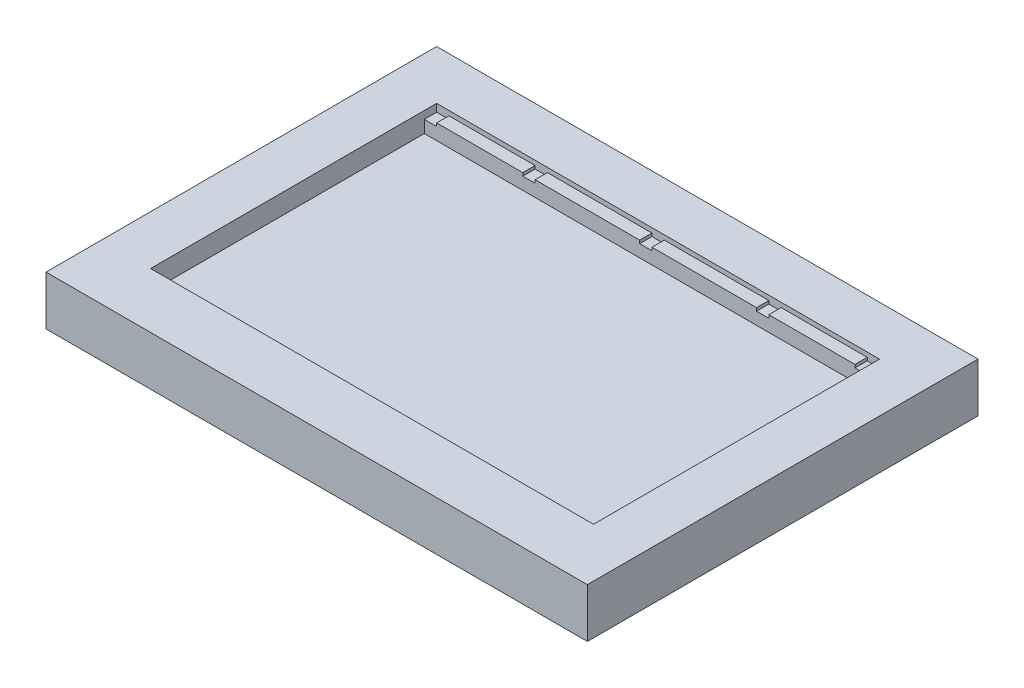
ISO-10303-21;
HEADER;
FILE_DESCRIPTION(('STEP AP214'),'2;1');
FILE_NAME('part.step','',(''),(''),'','','');
FILE_SCHEMA(('AUTOMOTIVE_DESIGN { 1 0 10303 214 1 1 1 1 }'));
ENDSEC;
DATA;
#1=APPLICATION_CONTEXT('core data for automotive mechanical design processes');
#2=APPLICATION_PROTOCOL_DEFINITION('international standard','automotive_design',2000,#1);
#3=PRODUCT_CONTEXT('',#1,'mechanical');
#4=PRODUCT('Part','Part','',(#3));
#5=PRODUCT_RELATED_PRODUCT_CATEGORY('part','',(#4));
#6=PRODUCT_DEFINITION_FORMATION('','',#4);
#7=PRODUCT_DEFINITION_CONTEXT('part definition',#1,'design');
#8=PRODUCT_DEFINITION('design','',#6,#7);
#9=PRODUCT_DEFINITION_SHAPE('','',#8);
#10=(LENGTH_UNIT() NAMED_UNIT(*) SI_UNIT(.MILLI.,.METRE.));
#11=(NAMED_UNIT(*) PLANE_ANGLE_UNIT() SI_UNIT($,.RADIAN.));
#12=(NAMED_UNIT(*) SI_UNIT($,.STERADIAN.) SOLID_ANGLE_UNIT());
#13=UNCERTAINTY_MEASURE_WITH_UNIT(LENGTH_MEASURE(1.E-05),#10,'distance_accuracy_value','');
#14=(GEOMETRIC_REPRESENTATION_CONTEXT(3) GLOBAL_UNCERTAINTY_ASSIGNED_CONTEXT((#13)) GLOBAL_UNIT_ASSIGNED_CONTEXT((#10,
#11,#12)) REPRESENTATION_CONTEXT('',''));
#15=CARTESIAN_POINT('',(0.,0.,0.));
#16=DIRECTION('',(0.,0.,1.));
#17=DIRECTION('',(1.,0.,0.));
#18=AXIS2_PLACEMENT_3D('',#15,#16,#17);
#19=CARTESIAN_POINT('',(0.,19.05,0.));
#20=DIRECTION('',(0.,1.,0.));
#21=DIRECTION('',(0.,0.,1.));
#22=AXIS2_PLACEMENT_3D('',#19,#20,#21);
#23=PLANE('',#22);
#24=DIRECTION('',(-1.,0.,0.));
#25=VECTOR('',#24,1.);
#26=CARTESIAN_POINT('',(0.,19.05,-285.75));
#27=LINE('',#26,#25);
#28=CARTESIAN_POINT('',(444.5,19.05,-285.75));
#29=VERTEX_POINT('',#28);
#30=CARTESIAN_POINT('',(355.6,19.05,-285.75));
#31=VERTEX_POINT('',#30);
#32=EDGE_CURVE('E11',#29,#31,#27,.T.);
#33=ORIENTED_EDGE('',*,*,#32,.F.);
#34=DIRECTION('',(0.,0.,1.));
#35=VECTOR('',#34,1.);
#36=CARTESIAN_POINT('',(444.5,19.05,-282.575));
#37=LINE('',#36,#35);
#38=CARTESIAN_POINT('',(444.5,19.05,-298.45));
#39=VERTEX_POINT('',#38);
#40=EDGE_CURVE('E381',#39,#29,#37,.T.);
#41=ORIENTED_EDGE('',*,*,#40,.F.);
#42=DIRECTION('',(-1.,0.,0.));
#43=VECTOR('',#42,1.);
#44=CARTESIAN_POINT('',(457.2,19.05,-298.45));
#45=LINE('',#44,#43);
#46=CARTESIAN_POINT('',(355.6,19.05,-298.45));
#47=VERTEX_POINT('',#46);
#48=EDGE_CURVE('E261',#39,#47,#45,.T.);
#49=ORIENTED_EDGE('',*,*,#48,.T.);
#50=DIRECTION('',(0.,0.,-1.));
#51=VECTOR('',#50,1.);
#52=CARTESIAN_POINT('',(355.6,19.05,-282.575));
#53=LINE('',#52,#51);
#54=EDGE_CURVE('E401',#31,#47,#53,.T.);
#55=ORIENTED_EDGE('',*,*,#54,.F.);
#56=EDGE_LOOP('',(#33,#41,#49,#55));
#57=FACE_BOUND('',#56,.T.);
#58=ADVANCED_FACE('F35',(#57),#23,.T.);
#59=CARTESIAN_POINT('',(342.9,19.05,-285.75));
#60=VERTEX_POINT('',#59);
#61=CARTESIAN_POINT('',(234.95,19.05,-285.75));
#62=VERTEX_POINT('',#61);
#63=EDGE_CURVE('E45',#60,#62,#27,.T.);
#64=ORIENTED_EDGE('',*,*,#63,.F.);
#65=DIRECTION('',(0.,0.,1.));
#66=VECTOR('',#65,1.);
#67=CARTESIAN_POINT('',(342.9,19.05,-282.575));
#68=LINE('',#67,#66);
#69=CARTESIAN_POINT('',(342.9,19.05,-298.45));
#70=VERTEX_POINT('',#69);
#71=EDGE_CURVE('E398',#70,#60,#68,.T.);
#72=ORIENTED_EDGE('',*,*,#71,.F.);
#73=CARTESIAN_POINT('',(234.95,19.05,-298.45));
#74=VERTEX_POINT('',#73);
#75=EDGE_CURVE('E263',#70,#74,#45,.T.);
#76=ORIENTED_EDGE('',*,*,#75,.T.);
#77=DIRECTION('',(0.,0.,-1.));
#78=VECTOR('',#77,1.);
#79=CARTESIAN_POINT('',(234.95,19.05,-282.575));
#80=LINE('',#79,#78);
#81=EDGE_CURVE('E317',#62,#74,#80,.T.);
#82=ORIENTED_EDGE('',*,*,#81,.F.);
#83=EDGE_LOOP('',(#64,#72,#76,#82));
#84=FACE_BOUND('',#83,.T.);
#85=ADVANCED_FACE('F468',(#84),#23,.T.);
#86=CARTESIAN_POINT('',(222.25,19.05,-285.75));
#87=VERTEX_POINT('',#86);
#88=CARTESIAN_POINT('',(114.3,19.05,-285.75));
#89=VERTEX_POINT('',#88);
#90=EDGE_CURVE('E320',#87,#89,#27,.T.);
#91=ORIENTED_EDGE('',*,*,#90,.F.);
#92=DIRECTION('',(0.,0.,1.));
#93=VECTOR('',#92,1.);
#94=CARTESIAN_POINT('',(222.25,19.05,-282.575));
#95=LINE('',#94,#93);
#96=CARTESIAN_POINT('',(222.25,19.05,-298.45));
#97=VERTEX_POINT('',#96);
#98=EDGE_CURVE('E408',#97,#87,#95,.T.);
#99=ORIENTED_EDGE('',*,*,#98,.F.);
#100=CARTESIAN_POINT('',(114.3,19.05,-298.45));
#101=VERTEX_POINT('',#100);
#102=EDGE_CURVE('E265',#97,#101,#45,.T.);
#103=ORIENTED_EDGE('',*,*,#102,.T.);
#104=DIRECTION('',(0.,0.,-1.));
#105=VECTOR('',#104,1.);
#106=CARTESIAN_POINT('',(114.3,19.05,-282.575));
#107=LINE('',#106,#105);
#108=EDGE_CURVE('E313',#89,#101,#107,.T.);
#109=ORIENTED_EDGE('',*,*,#108,.F.);
#110=EDGE_LOOP('',(#91,#99,#103,#109));
#111=FACE_BOUND('',#110,.T.);
#112=ADVANCED_FACE('F520',(#111),#23,.T.);
#113=CARTESIAN_POINT('',(0.,3.175,0.));
#114=DIRECTION('',(1.,0.,0.));
#115=DIRECTION('',(0.,0.,-1.));
#116=AXIS2_PLACEMENT_3D('',#113,#114,#115);
#117=PLANE('',#116);
#118=DIRECTION('',(0.,1.,0.));
#119=VECTOR('',#118,1.);
#120=CARTESIAN_POINT('',(0.,3.175,-3.175));
#121=LINE('',#120,#119);
#122=CARTESIAN_POINT('',(0.,3.175,-3.175));
#123=VERTEX_POINT('',#122);
#124=CARTESIAN_POINT('',(0.,23.8125,-3.175));
#125=VERTEX_POINT('',#124);
#126=EDGE_CURVE('E220',#123,#125,#121,.T.);
#127=ORIENTED_EDGE('',*,*,#126,.F.);
#128=DIRECTION('',(0.,0.,1.));
#129=VECTOR('',#128,1.);
#130=CARTESIAN_POINT('',(0.,3.175,-285.75));
#131=LINE('',#130,#129);
#132=CARTESIAN_POINT('',(0.,3.175,-285.75));
#133=VERTEX_POINT('',#132);
#134=EDGE_CURVE('E212',#133,#123,#131,.T.);
#135=ORIENTED_EDGE('',*,*,#134,.F.);
#136=DIRECTION('',(0.,-1.,0.));
#137=VECTOR('',#136,1.);
#138=CARTESIAN_POINT('',(0.,3.175,-285.75));
#139=LINE('',#138,#137);
#140=CARTESIAN_POINT('',(0.,15.875,-285.75));
#141=VERTEX_POINT('',#140);
#142=EDGE_CURVE('E354',#141,#133,#139,.T.);
#143=ORIENTED_EDGE('',*,*,#142,.F.);
#144=DIRECTION('',(0.,0.,1.));
#145=VECTOR('',#144,1.);
#146=CARTESIAN_POINT('',(0.,15.875,-282.575));
#147=LINE('',#146,#145);
#148=CARTESIAN_POINT('',(0.,15.875,-298.45));
#149=VERTEX_POINT('',#148);
#150=EDGE_CURVE('E290',#149,#141,#147,.T.);
#151=ORIENTED_EDGE('',*,*,#150,.F.);
#152=DIRECTION('',(0.,-1.,0.));
#153=VECTOR('',#152,1.);
#154=CARTESIAN_POINT('',(0.,19.05,-298.45));
#155=LINE('',#154,#153);
#156=CARTESIAN_POINT('',(0.,23.8125,-298.45));
#157=VERTEX_POINT('',#156);
#158=EDGE_CURVE('E280',#157,#149,#155,.T.);
#159=ORIENTED_EDGE('',*,*,#158,.F.);
#160=DIRECTION('',(0.,0.,-1.));
#161=VECTOR('',#160,1.);
#162=CARTESIAN_POINT('',(0.,23.8125,0.));
#163=LINE('',#162,#161);
#164=EDGE_CURVE('E39',#125,#157,#163,.T.);
#165=ORIENTED_EDGE('',*,*,#164,.F.);
#166=EDGE_LOOP('',(#127,#135,#143,#151,#159,#165));
#167=FACE_BOUND('',#166,.T.);
#168=ADVANCED_FACE('F221',(#167),#117,.T.);
#169=CARTESIAN_POINT('',(457.2,3.175,0.));
#170=DIRECTION('',(-1.,0.,0.));
#171=DIRECTION('',(0.,0.,1.));
#172=AXIS2_PLACEMENT_3D('',#169,#170,#171);
#173=PLANE('',#172);
#174=DIRECTION('',(0.,-1.,0.));
#175=VECTOR('',#174,1.);
#176=CARTESIAN_POINT('',(457.2,23.8125,-3.175));
#177=LINE('',#176,#175);
#178=CARTESIAN_POINT('',(457.2,23.8125,-3.175));
#179=VERTEX_POINT('',#178);
#180=CARTESIAN_POINT('',(457.2,3.175,-3.175));
#181=VERTEX_POINT('',#180);
#182=EDGE_CURVE('E53',#179,#181,#177,.T.);
#183=ORIENTED_EDGE('',*,*,#182,.F.);
#184=DIRECTION('',(0.,0.,1.));
#185=VECTOR('',#184,1.);
#186=CARTESIAN_POINT('',(457.2,23.8125,0.));
#187=LINE('',#186,#185);
#188=CARTESIAN_POINT('',(457.2,23.8125,-298.45));
#189=VERTEX_POINT('',#188);
#190=EDGE_CURVE('E287',#189,#179,#187,.T.);
#191=ORIENTED_EDGE('',*,*,#190,.F.);
#192=DIRECTION('',(0.,-1.,0.));
#193=VECTOR('',#192,1.);
#194=CARTESIAN_POINT('',(457.2,19.05,-298.45));
#195=LINE('',#194,#193);
#196=CARTESIAN_POINT('',(457.2,15.875,-298.45));
#197=VERTEX_POINT('',#196);
#198=EDGE_CURVE('E284',#189,#197,#195,.T.);
#199=ORIENTED_EDGE('',*,*,#198,.T.);
#200=DIRECTION('',(0.,0.,-1.));
#201=VECTOR('',#200,1.);
#202=CARTESIAN_POINT('',(457.2,15.875,-282.575));
#203=LINE('',#202,#201);
#204=CARTESIAN_POINT('',(457.2,15.875,-285.75));
#205=VERTEX_POINT('',#204);
#206=EDGE_CURVE('E386',#205,#197,#203,.T.);
#207=ORIENTED_EDGE('',*,*,#206,.F.);
#208=DIRECTION('',(0.,-1.,0.));
#209=VECTOR('',#208,1.);
#210=CARTESIAN_POINT('',(457.2,3.175,-285.75));
#211=LINE('',#210,#209);
#212=CARTESIAN_POINT('',(457.2,3.175,-285.75));
#213=VERTEX_POINT('',#212);
#214=EDGE_CURVE('E288',#205,#213,#211,.T.);
#215=ORIENTED_EDGE('',*,*,#214,.T.);
#216=DIRECTION('',(0.,0.,-1.));
#217=VECTOR('',#216,1.);
#218=CARTESIAN_POINT('',(457.2,3.175,0.));
#219=LINE('',#218,#217);
#220=EDGE_CURVE('E218',#181,#213,#219,.T.);
#221=ORIENTED_EDGE('',*,*,#220,.F.);
#222=EDGE_LOOP('',(#183,#191,#199,#207,#215,#221));
#223=FACE_BOUND('',#222,.T.);
#224=ADVANCED_FACE('F546',(#223),#173,.T.);
#225=CARTESIAN_POINT('',(0.,3.175,-285.75));
#226=DIRECTION('',(0.,0.,1.));
#227=DIRECTION('',(1.,0.,0.));
#228=AXIS2_PLACEMENT_3D('',#225,#226,#227);
#229=PLANE('',#228);
#230=DIRECTION('',(-1.,0.,0.));
#231=VECTOR('',#230,1.);
#232=CARTESIAN_POINT('',(457.2,3.175,-285.75));
#233=LINE('',#232,#231);
#234=EDGE_CURVE('E217',#213,#133,#233,.T.);
#235=ORIENTED_EDGE('',*,*,#234,.F.);
#236=ORIENTED_EDGE('',*,*,#214,.F.);
#237=DIRECTION('',(-1.,0.,0.));
#238=VECTOR('',#237,1.);
#239=CARTESIAN_POINT('',(444.5,15.875,-285.75));
#240=LINE('',#239,#238);
#241=CARTESIAN_POINT('',(444.5,15.875,-285.75));
#242=VERTEX_POINT('',#241);
#243=EDGE_CURVE('E296',#205,#242,#240,.T.);
#244=ORIENTED_EDGE('',*,*,#243,.T.);
#245=DIRECTION('',(0.,1.,0.));
#246=VECTOR('',#245,1.);
#247=CARTESIAN_POINT('',(444.5,15.875,-285.75));
#248=LINE('',#247,#246);
#249=EDGE_CURVE('E234',#242,#29,#248,.T.);
#250=ORIENTED_EDGE('',*,*,#249,.T.);
#251=ORIENTED_EDGE('',*,*,#32,.T.);
#252=DIRECTION('',(0.,-1.,0.));
#253=VECTOR('',#252,1.);
#254=CARTESIAN_POINT('',(355.6,15.875,-285.75));
#255=LINE('',#254,#253);
#256=CARTESIAN_POINT('',(355.6,15.875,-285.75));
#257=VERTEX_POINT('',#256);
#258=EDGE_CURVE('E236',#31,#257,#255,.T.);
#259=ORIENTED_EDGE('',*,*,#258,.T.);
#260=DIRECTION('',(-1.,0.,0.));
#261=VECTOR('',#260,1.);
#262=CARTESIAN_POINT('',(342.9,15.875,-285.75));
#263=LINE('',#262,#261);
#264=CARTESIAN_POINT('',(342.9,15.875,-285.75));
#265=VERTEX_POINT('',#264);
#266=EDGE_CURVE('E365',#257,#265,#263,.T.);
#267=ORIENTED_EDGE('',*,*,#266,.T.);
#268=DIRECTION('',(0.,1.,0.));
#269=VECTOR('',#268,1.);
#270=CARTESIAN_POINT('',(342.9,15.875,-285.75));
#271=LINE('',#270,#269);
#272=EDGE_CURVE('E238',#265,#60,#271,.T.);
#273=ORIENTED_EDGE('',*,*,#272,.T.);
#274=ORIENTED_EDGE('',*,*,#63,.T.);
#275=DIRECTION('',(0.,-1.,0.));
#276=VECTOR('',#275,1.);
#277=CARTESIAN_POINT('',(234.95,15.875,-285.75));
#278=LINE('',#277,#276);
#279=CARTESIAN_POINT('',(234.95,15.875,-285.75));
#280=VERTEX_POINT('',#279);
#281=EDGE_CURVE('E240',#62,#280,#278,.T.);
#282=ORIENTED_EDGE('',*,*,#281,.T.);
#283=DIRECTION('',(-1.,0.,0.));
#284=VECTOR('',#283,1.);
#285=CARTESIAN_POINT('',(222.25,15.875,-285.75));
#286=LINE('',#285,#284);
#287=CARTESIAN_POINT('',(222.25,15.875,-285.75));
#288=VERTEX_POINT('',#287);
#289=EDGE_CURVE('E362',#280,#288,#286,.T.);
#290=ORIENTED_EDGE('',*,*,#289,.T.);
#291=DIRECTION('',(0.,1.,0.));
#292=VECTOR('',#291,1.);
#293=CARTESIAN_POINT('',(222.25,15.875,-285.75));
#294=LINE('',#293,#292);
#295=EDGE_CURVE('E242',#288,#87,#294,.T.);
#296=ORIENTED_EDGE('',*,*,#295,.T.);
#297=ORIENTED_EDGE('',*,*,#90,.T.);
#298=DIRECTION('',(0.,-1.,0.));
#299=VECTOR('',#298,1.);
#300=CARTESIAN_POINT('',(114.3,15.875,-285.75));
#301=LINE('',#300,#299);
#302=CARTESIAN_POINT('',(114.3,15.875,-285.75));
#303=VERTEX_POINT('',#302);
#304=EDGE_CURVE('E244',#89,#303,#301,.T.);
#305=ORIENTED_EDGE('',*,*,#304,.T.);
#306=DIRECTION('',(-1.,0.,0.));
#307=VECTOR('',#306,1.);
#308=CARTESIAN_POINT('',(101.6,15.875,-285.75));
#309=LINE('',#308,#307);
#310=CARTESIAN_POINT('',(101.6,15.875,-285.75));
#311=VERTEX_POINT('',#310);
#312=EDGE_CURVE('E359',#303,#311,#309,.T.);
#313=ORIENTED_EDGE('',*,*,#312,.T.);
#314=DIRECTION('',(0.,1.,0.));
#315=VECTOR('',#314,1.);
#316=CARTESIAN_POINT('',(101.6,15.875,-285.75));
#317=LINE('',#316,#315);
#318=CARTESIAN_POINT('',(101.6,19.05,-285.75));
#319=VERTEX_POINT('',#318);
#320=EDGE_CURVE('E246',#311,#319,#317,.T.);
#321=ORIENTED_EDGE('',*,*,#320,.T.);
#322=CARTESIAN_POINT('',(12.7,19.05,-285.75));
#323=VERTEX_POINT('',#322);
#324=EDGE_CURVE('E46',#319,#323,#27,.T.);
#325=ORIENTED_EDGE('',*,*,#324,.T.);
#326=DIRECTION('',(0.,-1.,0.));
#327=VECTOR('',#326,1.);
#328=CARTESIAN_POINT('',(12.7,15.875,-285.75));
#329=LINE('',#328,#327);
#330=CARTESIAN_POINT('',(12.7,15.875,-285.75));
#331=VERTEX_POINT('',#330);
#332=EDGE_CURVE('E248',#323,#331,#329,.T.);
#333=ORIENTED_EDGE('',*,*,#332,.T.);
#334=DIRECTION('',(-1.,0.,0.));
#335=VECTOR('',#334,1.);
#336=CARTESIAN_POINT('',(0.,15.875,-285.75));
#337=LINE('',#336,#335);
#338=EDGE_CURVE('E356',#331,#141,#337,.T.);
#339=ORIENTED_EDGE('',*,*,#338,.T.);
#340=ORIENTED_EDGE('',*,*,#142,.T.);
#341=EDGE_LOOP('',(#235,#236,#244,#250,#251,#259,#267,#273,#274,#282,#290,#296,#297,#305,#313,
#321,#325,#333,#339,#340));
#342=FACE_BOUND('',#341,.T.);
#343=ADVANCED_FACE('F370',(#342),#229,.T.);
#344=CARTESIAN_POINT('',(0.,15.875,0.));
#345=DIRECTION('',(0.,-1.,0.));
#346=DIRECTION('',(0.,0.,-1.));
#347=AXIS2_PLACEMENT_3D('',#344,#345,#346);
#348=PLANE('',#347);
#349=ORIENTED_EDGE('',*,*,#243,.F.);
#350=ORIENTED_EDGE('',*,*,#206,.T.);
#351=DIRECTION('',(-1.,0.,0.));
#352=VECTOR('',#351,1.);
#353=CARTESIAN_POINT('',(457.2,15.875,-298.45));
#354=LINE('',#353,#352);
#355=CARTESIAN_POINT('',(444.5,15.875,-298.45));
#356=VERTEX_POINT('',#355);
#357=EDGE_CURVE('E377',#197,#356,#354,.T.);
#358=ORIENTED_EDGE('',*,*,#357,.T.);
#359=DIRECTION('',(0.,0.,1.));
#360=VECTOR('',#359,1.);
#361=CARTESIAN_POINT('',(444.5,15.875,-282.575));
#362=LINE('',#361,#360);
#363=EDGE_CURVE('E375',#356,#242,#362,.T.);
#364=ORIENTED_EDGE('',*,*,#363,.T.);
#365=EDGE_LOOP('',(#349,#350,#358,#364));
#366=FACE_BOUND('',#365,.T.);
#367=ADVANCED_FACE('F376',(#366),#348,.F.);
#368=CARTESIAN_POINT('',(0.,19.05,-298.45));
#369=DIRECTION('',(0.,0.,1.));
#370=DIRECTION('',(1.,0.,0.));
#371=AXIS2_PLACEMENT_3D('',#368,#369,#370);
#372=PLANE('',#371);
#373=DIRECTION('',(-1.,0.,0.));
#374=VECTOR('',#373,1.);
#375=CARTESIAN_POINT('',(0.,15.875,-298.45));
#376=LINE('',#375,#374);
#377=CARTESIAN_POINT('',(12.7,15.875,-298.45));
#378=VERTEX_POINT('',#377);
#379=EDGE_CURVE('E298',#378,#149,#376,.T.);
#380=ORIENTED_EDGE('',*,*,#379,.F.);
#381=DIRECTION('',(0.,-1.,0.));
#382=VECTOR('',#381,1.);
#383=CARTESIAN_POINT('',(12.7,19.05,-298.45));
#384=LINE('',#383,#382);
#385=CARTESIAN_POINT('',(12.7,19.05,-298.45));
#386=VERTEX_POINT('',#385);
#387=EDGE_CURVE('E292',#386,#378,#384,.T.);
#388=ORIENTED_EDGE('',*,*,#387,.F.);
#389=CARTESIAN_POINT('',(101.6,19.05,-298.45));
#390=VERTEX_POINT('',#389);
#391=EDGE_CURVE('E257',#390,#386,#45,.T.);
#392=ORIENTED_EDGE('',*,*,#391,.F.);
#393=DIRECTION('',(0.,-1.,0.));
#394=VECTOR('',#393,1.);
#395=CARTESIAN_POINT('',(101.6,19.05,-298.45));
#396=LINE('',#395,#394);
#397=CARTESIAN_POINT('',(101.6,15.875,-298.45));
#398=VERTEX_POINT('',#397);
#399=EDGE_CURVE('E315',#390,#398,#396,.T.);
#400=ORIENTED_EDGE('',*,*,#399,.T.);
#401=DIRECTION('',(-1.,0.,0.));
#402=VECTOR('',#401,1.);
#403=CARTESIAN_POINT('',(101.6,15.875,-298.45));
#404=LINE('',#403,#402);
#405=CARTESIAN_POINT('',(114.3,15.875,-298.45));
#406=VERTEX_POINT('',#405);
#407=EDGE_CURVE('E310',#406,#398,#404,.T.);
#408=ORIENTED_EDGE('',*,*,#407,.F.);
#409=DIRECTION('',(0.,-1.,0.));
#410=VECTOR('',#409,1.);
#411=CARTESIAN_POINT('',(114.3,19.05,-298.45));
#412=LINE('',#411,#410);
#413=EDGE_CURVE('E307',#101,#406,#412,.T.);
#414=ORIENTED_EDGE('',*,*,#413,.F.);
#415=ORIENTED_EDGE('',*,*,#102,.F.);
#416=DIRECTION('',(0.,-1.,0.));
#417=VECTOR('',#416,1.);
#418=CARTESIAN_POINT('',(222.25,19.05,-298.45));
#419=LINE('',#418,#417);
#420=CARTESIAN_POINT('',(222.25,15.875,-298.45));
#421=VERTEX_POINT('',#420);
#422=EDGE_CURVE('E414',#97,#421,#419,.T.);
#423=ORIENTED_EDGE('',*,*,#422,.T.);
#424=DIRECTION('',(-1.,0.,0.));
#425=VECTOR('',#424,1.);
#426=CARTESIAN_POINT('',(222.25,15.875,-298.45));
#427=LINE('',#426,#425);
#428=CARTESIAN_POINT('',(234.95,15.875,-298.45));
#429=VERTEX_POINT('',#428);
#430=EDGE_CURVE('E411',#429,#421,#427,.T.);
#431=ORIENTED_EDGE('',*,*,#430,.F.);
#432=DIRECTION('',(0.,-1.,0.));
#433=VECTOR('',#432,1.);
#434=CARTESIAN_POINT('',(234.95,19.05,-298.45));
#435=LINE('',#434,#433);
#436=EDGE_CURVE('E417',#74,#429,#435,.T.);
#437=ORIENTED_EDGE('',*,*,#436,.F.);
#438=ORIENTED_EDGE('',*,*,#75,.F.);
#439=DIRECTION('',(0.,-1.,0.));
#440=VECTOR('',#439,1.);
#441=CARTESIAN_POINT('',(342.9,19.05,-298.45));
#442=LINE('',#441,#440);
#443=CARTESIAN_POINT('',(342.9,15.875,-298.45));
#444=VERTEX_POINT('',#443);
#445=EDGE_CURVE('E395',#70,#444,#442,.T.);
#446=ORIENTED_EDGE('',*,*,#445,.T.);
#447=DIRECTION('',(-1.,0.,0.));
#448=VECTOR('',#447,1.);
#449=CARTESIAN_POINT('',(355.6,15.875,-298.45));
#450=LINE('',#449,#448);
#451=CARTESIAN_POINT('',(355.6,15.875,-298.45));
#452=VERTEX_POINT('',#451);
#453=EDGE_CURVE('E444',#452,#444,#450,.T.);
#454=ORIENTED_EDGE('',*,*,#453,.F.);
#455=DIRECTION('',(0.,-1.,0.));
#456=VECTOR('',#455,1.);
#457=CARTESIAN_POINT('',(355.6,19.05,-298.45));
#458=LINE('',#457,#456);
#459=EDGE_CURVE('E391',#47,#452,#458,.T.);
#460=ORIENTED_EDGE('',*,*,#459,.F.);
#461=ORIENTED_EDGE('',*,*,#48,.F.);
#462=DIRECTION('',(0.,-1.,0.));
#463=VECTOR('',#462,1.);
#464=CARTESIAN_POINT('',(444.5,19.05,-298.45));
#465=LINE('',#464,#463);
#466=EDGE_CURVE('E384',#39,#356,#465,.T.);
#467=ORIENTED_EDGE('',*,*,#466,.T.);
#468=ORIENTED_EDGE('',*,*,#357,.F.);
#469=ORIENTED_EDGE('',*,*,#198,.F.);
#470=DIRECTION('',(-1.,0.,0.));
#471=VECTOR('',#470,1.);
#472=CARTESIAN_POINT('',(457.2,23.8125,-298.45));
#473=LINE('',#472,#471);
#474=EDGE_CURVE('E250',#189,#157,#473,.T.);
#475=ORIENTED_EDGE('',*,*,#474,.T.);
#476=ORIENTED_EDGE('',*,*,#158,.T.);
#477=EDGE_LOOP('',(#380,#388,#392,#400,#408,#414,#415,#423,#431,#437,#438,#446,#454,#460,#461,
#467,#468,#469,#475,#476));
#478=FACE_BOUND('',#477,.T.);
#479=ADVANCED_FACE('F279',(#478),#372,.T.);
#480=CARTESIAN_POINT('',(0.,15.875,0.));
#481=DIRECTION('',(0.,-1.,0.));
#482=DIRECTION('',(0.,0.,-1.));
#483=AXIS2_PLACEMENT_3D('',#480,#481,#482);
#484=PLANE('',#483);
#485=ORIENTED_EDGE('',*,*,#338,.F.);
#486=DIRECTION('',(0.,0.,-1.));
#487=VECTOR('',#486,1.);
#488=CARTESIAN_POINT('',(12.7,15.875,-282.575));
#489=LINE('',#488,#487);
#490=EDGE_CURVE('E303',#331,#378,#489,.T.);
#491=ORIENTED_EDGE('',*,*,#490,.T.);
#492=ORIENTED_EDGE('',*,*,#379,.T.);
#493=ORIENTED_EDGE('',*,*,#150,.T.);
#494=EDGE_LOOP('',(#485,#491,#492,#493));
#495=FACE_BOUND('',#494,.T.);
#496=ADVANCED_FACE('F505',(#495),#484,.F.);
#497=CARTESIAN_POINT('',(12.7,15.875,-285.75));
#498=DIRECTION('',(-1.,0.,0.));
#499=DIRECTION('',(0.,0.,1.));
#500=AXIS2_PLACEMENT_3D('',#497,#498,#499);
#501=PLANE('',#500);
#502=ORIENTED_EDGE('',*,*,#332,.F.);
#503=DIRECTION('',(0.,0.,-1.));
#504=VECTOR('',#503,1.);
#505=CARTESIAN_POINT('',(12.7,19.05,-282.575));
#506=LINE('',#505,#504);
#507=EDGE_CURVE('E293',#323,#386,#506,.T.);
#508=ORIENTED_EDGE('',*,*,#507,.T.);
#509=ORIENTED_EDGE('',*,*,#387,.T.);
#510=ORIENTED_EDGE('',*,*,#490,.F.);
#511=EDGE_LOOP('',(#502,#508,#509,#510));
#512=FACE_BOUND('',#511,.T.);
#513=ADVANCED_FACE('F501',(#512),#501,.T.);
#514=CARTESIAN_POINT('',(101.6,15.875,-285.75));
#515=DIRECTION('',(1.,0.,0.));
#516=DIRECTION('',(0.,0.,-1.));
#517=AXIS2_PLACEMENT_3D('',#514,#515,#516);
#518=PLANE('',#517);
#519=ORIENTED_EDGE('',*,*,#320,.F.);
#520=DIRECTION('',(0.,0.,1.));
#521=VECTOR('',#520,1.);
#522=CARTESIAN_POINT('',(101.6,15.875,-282.575));
#523=LINE('',#522,#521);
#524=EDGE_CURVE('E422',#398,#311,#523,.T.);
#525=ORIENTED_EDGE('',*,*,#524,.F.);
#526=ORIENTED_EDGE('',*,*,#399,.F.);
#527=DIRECTION('',(0.,0.,1.));
#528=VECTOR('',#527,1.);
#529=CARTESIAN_POINT('',(101.6,19.05,-282.575));
#530=LINE('',#529,#528);
#531=EDGE_CURVE('E316',#390,#319,#530,.T.);
#532=ORIENTED_EDGE('',*,*,#531,.T.);
#533=EDGE_LOOP('',(#519,#525,#526,#532));
#534=FACE_BOUND('',#533,.T.);
#535=ADVANCED_FACE('F498',(#534),#518,.T.);
#536=CARTESIAN_POINT('',(0.,15.875,0.));
#537=DIRECTION('',(0.,-1.,0.));
#538=DIRECTION('',(0.,0.,-1.));
#539=AXIS2_PLACEMENT_3D('',#536,#537,#538);
#540=PLANE('',#539);
#541=ORIENTED_EDGE('',*,*,#312,.F.);
#542=DIRECTION('',(0.,0.,-1.));
#543=VECTOR('',#542,1.);
#544=CARTESIAN_POINT('',(114.3,15.875,-282.575));
#545=LINE('',#544,#543);
#546=EDGE_CURVE('E489',#303,#406,#545,.T.);
#547=ORIENTED_EDGE('',*,*,#546,.T.);
#548=ORIENTED_EDGE('',*,*,#407,.T.);
#549=ORIENTED_EDGE('',*,*,#524,.T.);
#550=EDGE_LOOP('',(#541,#547,#548,#549));
#551=FACE_BOUND('',#550,.T.);
#552=ADVANCED_FACE('F495',(#551),#540,.F.);
#553=CARTESIAN_POINT('',(114.3,15.875,-285.75));
#554=DIRECTION('',(-1.,0.,0.));
#555=DIRECTION('',(0.,0.,1.));
#556=AXIS2_PLACEMENT_3D('',#553,#554,#555);
#557=PLANE('',#556);
#558=ORIENTED_EDGE('',*,*,#304,.F.);
#559=ORIENTED_EDGE('',*,*,#108,.T.);
#560=ORIENTED_EDGE('',*,*,#413,.T.);
#561=ORIENTED_EDGE('',*,*,#546,.F.);
#562=EDGE_LOOP('',(#558,#559,#560,#561));
#563=FACE_BOUND('',#562,.T.);
#564=ADVANCED_FACE('F657',(#563),#557,.T.);
#565=CARTESIAN_POINT('',(222.25,15.875,-285.75));
#566=DIRECTION('',(1.,0.,0.));
#567=DIRECTION('',(0.,0.,-1.));
#568=AXIS2_PLACEMENT_3D('',#565,#566,#567);
#569=PLANE('',#568);
#570=ORIENTED_EDGE('',*,*,#295,.F.);
#571=DIRECTION('',(0.,0.,1.));
#572=VECTOR('',#571,1.);
#573=CARTESIAN_POINT('',(222.25,15.875,-282.575));
#574=LINE('',#573,#572);
#575=EDGE_CURVE('E394',#421,#288,#574,.T.);
#576=ORIENTED_EDGE('',*,*,#575,.F.);
#577=ORIENTED_EDGE('',*,*,#422,.F.);
#578=ORIENTED_EDGE('',*,*,#98,.T.);
#579=EDGE_LOOP('',(#570,#576,#577,#578));
#580=FACE_BOUND('',#579,.T.);
#581=ADVANCED_FACE('F648',(#580),#569,.T.);
#582=CARTESIAN_POINT('',(0.,15.875,0.));
#583=DIRECTION('',(0.,-1.,0.));
#584=DIRECTION('',(0.,0.,-1.));
#585=AXIS2_PLACEMENT_3D('',#582,#583,#584);
#586=PLANE('',#585);
#587=ORIENTED_EDGE('',*,*,#289,.F.);
#588=DIRECTION('',(0.,0.,-1.));
#589=VECTOR('',#588,1.);
#590=CARTESIAN_POINT('',(234.95,15.875,-282.575));
#591=LINE('',#590,#589);
#592=EDGE_CURVE('E478',#280,#429,#591,.T.);
#593=ORIENTED_EDGE('',*,*,#592,.T.);
#594=ORIENTED_EDGE('',*,*,#430,.T.);
#595=ORIENTED_EDGE('',*,*,#575,.T.);
#596=EDGE_LOOP('',(#587,#593,#594,#595));
#597=FACE_BOUND('',#596,.T.);
#598=ADVANCED_FACE('F482',(#597),#586,.F.);
#599=CARTESIAN_POINT('',(234.95,15.875,-285.75));
#600=DIRECTION('',(-1.,0.,0.));
#601=DIRECTION('',(0.,0.,1.));
#602=AXIS2_PLACEMENT_3D('',#599,#600,#601);
#603=PLANE('',#602);
#604=ORIENTED_EDGE('',*,*,#281,.F.);
#605=ORIENTED_EDGE('',*,*,#81,.T.);
#606=ORIENTED_EDGE('',*,*,#436,.T.);
#607=ORIENTED_EDGE('',*,*,#592,.F.);
#608=EDGE_LOOP('',(#604,#605,#606,#607));
#609=FACE_BOUND('',#608,.T.);
#610=ADVANCED_FACE('F477',(#609),#603,.T.);
#611=CARTESIAN_POINT('',(342.9,15.875,-285.75));
#612=DIRECTION('',(1.,0.,0.));
#613=DIRECTION('',(0.,0.,-1.));
#614=AXIS2_PLACEMENT_3D('',#611,#612,#613);
#615=PLANE('',#614);
#616=ORIENTED_EDGE('',*,*,#272,.F.);
#617=DIRECTION('',(0.,0.,1.));
#618=VECTOR('',#617,1.);
#619=CARTESIAN_POINT('',(342.9,15.875,-282.575));
#620=LINE('',#619,#618);
#621=EDGE_CURVE('E437',#444,#265,#620,.T.);
#622=ORIENTED_EDGE('',*,*,#621,.F.);
#623=ORIENTED_EDGE('',*,*,#445,.F.);
#624=ORIENTED_EDGE('',*,*,#71,.T.);
#625=EDGE_LOOP('',(#616,#622,#623,#624));
#626=FACE_BOUND('',#625,.T.);
#627=ADVANCED_FACE('F471',(#626),#615,.T.);
#628=CARTESIAN_POINT('',(0.,15.875,0.));
#629=DIRECTION('',(0.,-1.,0.));
#630=DIRECTION('',(0.,0.,-1.));
#631=AXIS2_PLACEMENT_3D('',#628,#629,#630);
#632=PLANE('',#631);
#633=ORIENTED_EDGE('',*,*,#266,.F.);
#634=DIRECTION('',(0.,0.,-1.));
#635=VECTOR('',#634,1.);
#636=CARTESIAN_POINT('',(355.6,15.875,-282.575));
#637=LINE('',#636,#635);
#638=EDGE_CURVE('E447',#257,#452,#637,.T.);
#639=ORIENTED_EDGE('',*,*,#638,.T.);
#640=ORIENTED_EDGE('',*,*,#453,.T.);
#641=ORIENTED_EDGE('',*,*,#621,.T.);
#642=EDGE_LOOP('',(#633,#639,#640,#641));
#643=FACE_BOUND('',#642,.T.);
#644=ADVANCED_FACE('F462',(#643),#632,.F.);
#645=CARTESIAN_POINT('',(355.6,15.875,-285.75));
#646=DIRECTION('',(-1.,0.,0.));
#647=DIRECTION('',(0.,0.,1.));
#648=AXIS2_PLACEMENT_3D('',#645,#646,#647);
#649=PLANE('',#648);
#650=ORIENTED_EDGE('',*,*,#258,.F.);
#651=ORIENTED_EDGE('',*,*,#54,.T.);
#652=ORIENTED_EDGE('',*,*,#459,.T.);
#653=ORIENTED_EDGE('',*,*,#638,.F.);
#654=EDGE_LOOP('',(#650,#651,#652,#653));
#655=FACE_BOUND('',#654,.T.);
#656=ADVANCED_FACE('F459',(#655),#649,.T.);
#657=CARTESIAN_POINT('',(444.5,15.875,-285.75));
#658=DIRECTION('',(1.,0.,0.));
#659=DIRECTION('',(0.,0.,-1.));
#660=AXIS2_PLACEMENT_3D('',#657,#658,#659);
#661=PLANE('',#660);
#662=ORIENTED_EDGE('',*,*,#249,.F.);
#663=ORIENTED_EDGE('',*,*,#363,.F.);
#664=ORIENTED_EDGE('',*,*,#466,.F.);
#665=ORIENTED_EDGE('',*,*,#40,.T.);
#666=EDGE_LOOP('',(#662,#663,#664,#665));
#667=FACE_BOUND('',#666,.T.);
#668=ADVANCED_FACE('F452',(#667),#661,.T.);
#669=CARTESIAN_POINT('',(0.,-26.9875,0.));
#670=DIRECTION('',(0.,1.,0.));
#671=DIRECTION('',(0.,0.,1.));
#672=AXIS2_PLACEMENT_3D('',#669,#670,#671);
#673=PLANE('',#672);
#674=DIRECTION('',(0.,0.,-1.));
#675=VECTOR('',#674,1.);
#676=CARTESIAN_POINT('',(508.,-26.9875,53.975));
#677=LINE('',#676,#675);
#678=CARTESIAN_POINT('',(508.,-26.9875,53.975));
#679=VERTEX_POINT('',#678);
#680=CARTESIAN_POINT('',(508.,-26.9875,-349.25));
#681=VERTEX_POINT('',#680);
#682=EDGE_CURVE('E345',#679,#681,#677,.T.);
#683=ORIENTED_EDGE('',*,*,#682,.F.);
#684=DIRECTION('',(1.,0.,0.));
#685=VECTOR('',#684,1.);
#686=CARTESIAN_POINT('',(508.,-26.9875,53.975));
#687=LINE('',#686,#685);
#688=CARTESIAN_POINT('',(-50.8,-26.9875,53.9750000000001));
#689=VERTEX_POINT('',#688);
#690=EDGE_CURVE('E335',#689,#679,#687,.T.);
#691=ORIENTED_EDGE('',*,*,#690,.F.);
#692=DIRECTION('',(0.,0.,1.));
#693=VECTOR('',#692,1.);
#694=CARTESIAN_POINT('',(-50.8,-26.9875,53.9750000000001));
#695=LINE('',#694,#693);
#696=CARTESIAN_POINT('',(-50.8,-26.9875,-349.25));
#697=VERTEX_POINT('',#696);
#698=EDGE_CURVE('E338',#697,#689,#695,.T.);
#699=ORIENTED_EDGE('',*,*,#698,.F.);
#700=DIRECTION('',(-1.,0.,0.));
#701=VECTOR('',#700,1.);
#702=CARTESIAN_POINT('',(508.,-26.9875,-349.25));
#703=LINE('',#702,#701);
#704=EDGE_CURVE('E342',#681,#697,#703,.T.);
#705=ORIENTED_EDGE('',*,*,#704,.F.);
#706=EDGE_LOOP('',(#683,#691,#699,#705));
#707=FACE_BOUND('',#706,.T.);
#708=ADVANCED_FACE('F524',(#707),#673,.F.);
#709=CARTESIAN_POINT('',(508.,-26.9875,53.975));
#710=DIRECTION('',(0.,0.,1.));
#711=DIRECTION('',(1.,0.,0.));
#712=AXIS2_PLACEMENT_3D('',#709,#710,#711);
#713=PLANE('',#712);
#714=DIRECTION('',(1.,0.,0.));
#715=VECTOR('',#714,1.);
#716=CARTESIAN_POINT('',(508.,23.8125,53.975));
#717=LINE('',#716,#715);
#718=CARTESIAN_POINT('',(-50.8,23.8125,53.9750000000001));
#719=VERTEX_POINT('',#718);
#720=CARTESIAN_POINT('',(508.,23.8125,53.975));
#721=VERTEX_POINT('',#720);
#722=EDGE_CURVE('E348',#719,#721,#717,.T.);
#723=ORIENTED_EDGE('',*,*,#722,.F.);
#724=DIRECTION('',(0.,1.,0.));
#725=VECTOR('',#724,1.);
#726=CARTESIAN_POINT('',(-50.8,-26.9875,53.9750000000001));
#727=LINE('',#726,#725);
#728=EDGE_CURVE('E769',#689,#719,#727,.T.);
#729=ORIENTED_EDGE('',*,*,#728,.F.);
#730=ORIENTED_EDGE('',*,*,#690,.T.);
#731=DIRECTION('',(0.,1.,0.));
#732=VECTOR('',#731,1.);
#733=CARTESIAN_POINT('',(508.,-26.9875,53.975));
#734=LINE('',#733,#732);
#735=EDGE_CURVE('E349',#679,#721,#734,.T.);
#736=ORIENTED_EDGE('',*,*,#735,.T.);
#737=EDGE_LOOP('',(#723,#729,#730,#736));
#738=FACE_BOUND('',#737,.T.);
#739=ADVANCED_FACE('F532',(#738),#713,.T.);
#740=CARTESIAN_POINT('',(-50.8,-26.9875,53.9750000000001));
#741=DIRECTION('',(-1.,0.,0.));
#742=DIRECTION('',(0.,0.,1.));
#743=AXIS2_PLACEMENT_3D('',#740,#741,#742);
#744=PLANE('',#743);
#745=DIRECTION('',(0.,0.,1.));
#746=VECTOR('',#745,1.);
#747=CARTESIAN_POINT('',(-50.8,23.8125,53.9750000000001));
#748=LINE('',#747,#746);
#749=CARTESIAN_POINT('',(-50.8,23.8125,-349.25));
#750=VERTEX_POINT('',#749);
#751=EDGE_CURVE('E331',#750,#719,#748,.T.);
#752=ORIENTED_EDGE('',*,*,#751,.F.);
#753=DIRECTION('',(0.,1.,0.));
#754=VECTOR('',#753,1.);
#755=CARTESIAN_POINT('',(-50.8,-26.9875,-349.25));
#756=LINE('',#755,#754);
#757=EDGE_CURVE('E771',#697,#750,#756,.T.);
#758=ORIENTED_EDGE('',*,*,#757,.F.);
#759=ORIENTED_EDGE('',*,*,#698,.T.);
#760=ORIENTED_EDGE('',*,*,#728,.T.);
#761=EDGE_LOOP('',(#752,#758,#759,#760));
#762=FACE_BOUND('',#761,.T.);
#763=ADVANCED_FACE('F539',(#762),#744,.T.);
#764=CARTESIAN_POINT('',(508.,-26.9875,-349.25));
#765=DIRECTION('',(0.,0.,-1.));
#766=DIRECTION('',(-1.,0.,0.));
#767=AXIS2_PLACEMENT_3D('',#764,#765,#766);
#768=PLANE('',#767);
#769=DIRECTION('',(-1.,0.,0.));
#770=VECTOR('',#769,1.);
#771=CARTESIAN_POINT('',(508.,23.8125,-349.25));
#772=LINE('',#771,#770);
#773=CARTESIAN_POINT('',(508.,23.8125,-349.25));
#774=VERTEX_POINT('',#773);
#775=EDGE_CURVE('E326',#774,#750,#772,.T.);
#776=ORIENTED_EDGE('',*,*,#775,.F.);
#777=DIRECTION('',(0.,1.,0.));
#778=VECTOR('',#777,1.);
#779=CARTESIAN_POINT('',(508.,-26.9875,-349.25));
#780=LINE('',#779,#778);
#781=EDGE_CURVE('E339',#681,#774,#780,.T.);
#782=ORIENTED_EDGE('',*,*,#781,.F.);
#783=ORIENTED_EDGE('',*,*,#704,.T.);
#784=ORIENTED_EDGE('',*,*,#757,.T.);
#785=EDGE_LOOP('',(#776,#782,#783,#784));
#786=FACE_BOUND('',#785,.T.);
#787=ADVANCED_FACE('F748',(#786),#768,.T.);
#788=CARTESIAN_POINT('',(508.,-26.9875,53.975));
#789=DIRECTION('',(1.,0.,0.));
#790=DIRECTION('',(0.,0.,-1.));
#791=AXIS2_PLACEMENT_3D('',#788,#789,#790);
#792=PLANE('',#791);
#793=DIRECTION('',(0.,0.,-1.));
#794=VECTOR('',#793,1.);
#795=CARTESIAN_POINT('',(508.,23.8125,53.975));
#796=LINE('',#795,#794);
#797=EDGE_CURVE('E321',#721,#774,#796,.T.);
#798=ORIENTED_EDGE('',*,*,#797,.F.);
#799=ORIENTED_EDGE('',*,*,#735,.F.);
#800=ORIENTED_EDGE('',*,*,#682,.T.);
#801=ORIENTED_EDGE('',*,*,#781,.T.);
#802=EDGE_LOOP('',(#798,#799,#800,#801));
#803=FACE_BOUND('',#802,.T.);
#804=ADVANCED_FACE('F529',(#803),#792,.T.);
#805=CARTESIAN_POINT('',(0.,23.8125,0.));
#806=DIRECTION('',(0.,1.,0.));
#807=DIRECTION('',(0.,0.,1.));
#808=AXIS2_PLACEMENT_3D('',#805,#806,#807);
#809=PLANE('',#808);
#810=DIRECTION('',(1.,0.,0.));
#811=VECTOR('',#810,1.);
#812=CARTESIAN_POINT('',(0.,23.8125,-3.175));
#813=LINE('',#812,#811);
#814=EDGE_CURVE('E225',#125,#179,#813,.T.);
#815=ORIENTED_EDGE('',*,*,#814,.F.);
#816=ORIENTED_EDGE('',*,*,#164,.T.);
#817=ORIENTED_EDGE('',*,*,#474,.F.);
#818=ORIENTED_EDGE('',*,*,#190,.T.);
#819=EDGE_LOOP('',(#815,#816,#817,#818));
#820=FACE_BOUND('',#819,.T.);
#821=ORIENTED_EDGE('',*,*,#797,.T.);
#822=ORIENTED_EDGE('',*,*,#775,.T.);
#823=ORIENTED_EDGE('',*,*,#751,.T.);
#824=ORIENTED_EDGE('',*,*,#722,.T.);
#825=EDGE_LOOP('',(#821,#822,#823,#824));
#826=FACE_BOUND('',#825,.T.);
#827=ADVANCED_FACE('F37',(#820,#826),#809,.T.);
#828=ORIENTED_EDGE('',*,*,#324,.F.);
#829=ORIENTED_EDGE('',*,*,#531,.F.);
#830=ORIENTED_EDGE('',*,*,#391,.T.);
#831=ORIENTED_EDGE('',*,*,#507,.F.);
#832=EDGE_LOOP('',(#828,#829,#830,#831));
#833=FACE_BOUND('',#832,.T.);
#834=ADVANCED_FACE('F499',(#833),#23,.T.);
#835=CARTESIAN_POINT('',(0.,3.175,0.));
#836=DIRECTION('',(0.,1.,0.));
#837=DIRECTION('',(0.,0.,1.));
#838=AXIS2_PLACEMENT_3D('',#835,#836,#837);
#839=PLANE('',#838);
#840=DIRECTION('',(-1.,0.,0.));
#841=VECTOR('',#840,1.);
#842=CARTESIAN_POINT('',(457.2,3.175,-3.175));
#843=LINE('',#842,#841);
#844=EDGE_CURVE('E215',#181,#123,#843,.T.);
#845=ORIENTED_EDGE('',*,*,#844,.F.);
#846=ORIENTED_EDGE('',*,*,#220,.T.);
#847=ORIENTED_EDGE('',*,*,#234,.T.);
#848=ORIENTED_EDGE('',*,*,#134,.T.);
#849=EDGE_LOOP('',(#845,#846,#847,#848));
#850=FACE_BOUND('',#849,.T.);
#851=ADVANCED_FACE('F213',(#850),#839,.T.);
#852=CARTESIAN_POINT('',(0.,0.,-3.175));
#853=DIRECTION('',(0.,0.,-1.));
#854=DIRECTION('',(-1.,0.,0.));
#855=AXIS2_PLACEMENT_3D('',#852,#853,#854);
#856=PLANE('',#855);
#857=ORIENTED_EDGE('',*,*,#182,.T.);
#858=ORIENTED_EDGE('',*,*,#844,.T.);
#859=ORIENTED_EDGE('',*,*,#126,.T.);
#860=ORIENTED_EDGE('',*,*,#814,.T.);
#861=EDGE_LOOP('',(#857,#858,#859,#860));
#862=FACE_BOUND('',#861,.T.);
#863=ADVANCED_FACE('F227',(#862),#856,.T.);
#864=CLOSED_SHELL('',(#58,#85,#112,#168,#224,#343,#367,#479,#496,#513,#535,#552,#564,#581,#598,
#610,#627,#644,#656,#668,#708,#739,#763,#787,#804,#827,#834,#851,#863));
#865=MANIFOLD_SOLID_BREP('B2',#864);
#866=ADVANCED_BREP_SHAPE_REPRESENTATION('',(#18,#865),#14);
#867=SHAPE_DEFINITION_REPRESENTATION(#9,#866);
ENDSEC;
END-ISO-10303-21;
